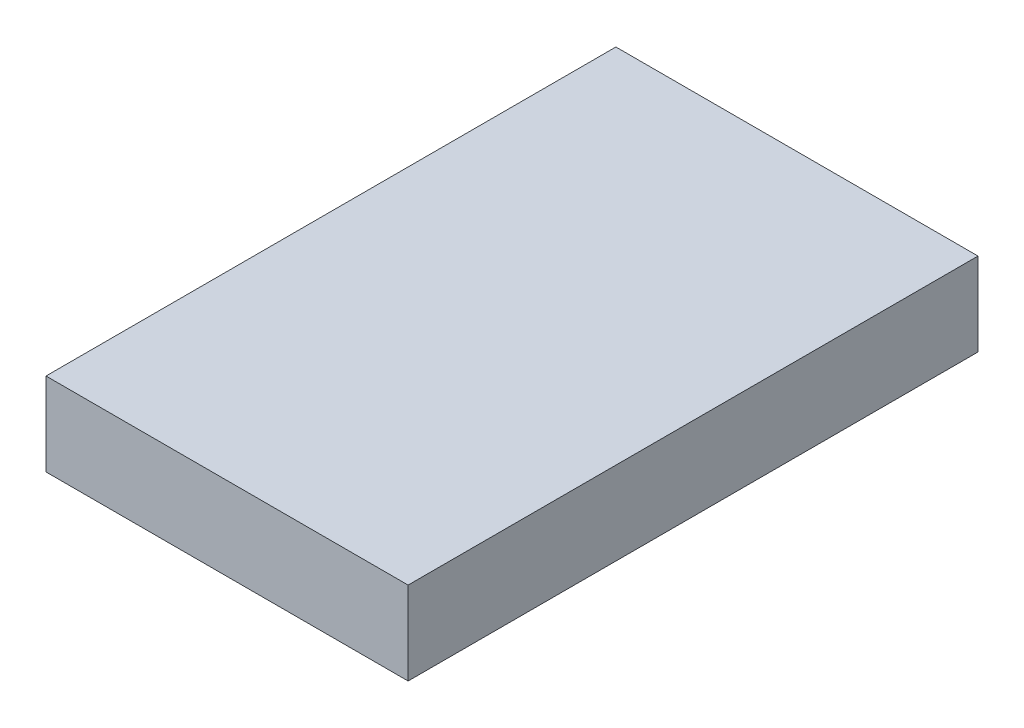
ISO-10303-21;
HEADER;
FILE_DESCRIPTION(('STEP AP214'),'2;1');
FILE_NAME('part.step','',(''),(''),'','','');
FILE_SCHEMA(('AUTOMOTIVE_DESIGN { 1 0 10303 214 1 1 1 1 }'));
ENDSEC;
DATA;
#1=APPLICATION_CONTEXT('core data for automotive mechanical design processes');
#2=APPLICATION_PROTOCOL_DEFINITION('international standard','automotive_design',2000,#1);
#3=PRODUCT_CONTEXT('',#1,'mechanical');
#4=PRODUCT('Part','Part','',(#3));
#5=PRODUCT_RELATED_PRODUCT_CATEGORY('part','',(#4));
#6=PRODUCT_DEFINITION_FORMATION('','',#4);
#7=PRODUCT_DEFINITION_CONTEXT('part definition',#1,'design');
#8=PRODUCT_DEFINITION('design','',#6,#7);
#9=PRODUCT_DEFINITION_SHAPE('','',#8);
#10=(LENGTH_UNIT() NAMED_UNIT(*) SI_UNIT(.MILLI.,.METRE.));
#11=(NAMED_UNIT(*) PLANE_ANGLE_UNIT() SI_UNIT($,.RADIAN.));
#12=(NAMED_UNIT(*) SI_UNIT($,.STERADIAN.) SOLID_ANGLE_UNIT());
#13=UNCERTAINTY_MEASURE_WITH_UNIT(LENGTH_MEASURE(1.E-05),#10,'distance_accuracy_value','');
#14=(GEOMETRIC_REPRESENTATION_CONTEXT(3) GLOBAL_UNCERTAINTY_ASSIGNED_CONTEXT((#13)) GLOBAL_UNIT_ASSIGNED_CONTEXT((#10,
#11,#12)) REPRESENTATION_CONTEXT('',''));
#15=CARTESIAN_POINT('',(0.,0.,0.));
#16=DIRECTION('',(0.,0.,1.));
#17=DIRECTION('',(1.,0.,0.));
#18=AXIS2_PLACEMENT_3D('',#15,#16,#17);
#19=CARTESIAN_POINT('',(193.675,88.9,-304.8));
#20=DIRECTION('',(-1.,0.,0.));
#21=DIRECTION('',(0.,0.,1.));
#22=AXIS2_PLACEMENT_3D('',#19,#20,#21);
#23=PLANE('',#22);
#24=DIRECTION('',(0.,0.,-1.));
#25=VECTOR('',#24,1.);
#26=CARTESIAN_POINT('',(193.675,0.,-304.8));
#27=LINE('',#26,#25);
#28=CARTESIAN_POINT('',(193.675,0.,304.8));
#29=VERTEX_POINT('',#28);
#30=CARTESIAN_POINT('',(193.675,0.,-304.8));
#31=VERTEX_POINT('',#30);
#32=EDGE_CURVE('E96',#29,#31,#27,.T.);
#33=ORIENTED_EDGE('',*,*,#32,.T.);
#34=DIRECTION('',(0.,-1.,0.));
#35=VECTOR('',#34,1.);
#36=CARTESIAN_POINT('',(193.675,88.9,-304.8));
#37=LINE('',#36,#35);
#38=CARTESIAN_POINT('',(193.675,88.9,-304.8));
#39=VERTEX_POINT('',#38);
#40=EDGE_CURVE('E11',#39,#31,#37,.T.);
#41=ORIENTED_EDGE('',*,*,#40,.F.);
#42=DIRECTION('',(0.,0.,-1.));
#43=VECTOR('',#42,1.);
#44=CARTESIAN_POINT('',(193.675,88.9,-304.8));
#45=LINE('',#44,#43);
#46=CARTESIAN_POINT('',(193.675,88.9,304.8));
#47=VERTEX_POINT('',#46);
#48=EDGE_CURVE('E84',#47,#39,#45,.T.);
#49=ORIENTED_EDGE('',*,*,#48,.F.);
#50=DIRECTION('',(0.,-1.,0.));
#51=VECTOR('',#50,1.);
#52=CARTESIAN_POINT('',(193.675,88.9,304.8));
#53=LINE('',#52,#51);
#54=EDGE_CURVE('E92',#47,#29,#53,.T.);
#55=ORIENTED_EDGE('',*,*,#54,.T.);
#56=EDGE_LOOP('',(#33,#41,#49,#55));
#57=FACE_BOUND('',#56,.T.);
#58=ADVANCED_FACE('F33',(#57),#23,.F.);
#59=CARTESIAN_POINT('',(-193.675,88.9,-304.8));
#60=DIRECTION('',(0.,0.,1.));
#61=DIRECTION('',(1.,0.,0.));
#62=AXIS2_PLACEMENT_3D('',#59,#60,#61);
#63=PLANE('',#62);
#64=DIRECTION('',(-1.,0.,0.));
#65=VECTOR('',#64,1.);
#66=CARTESIAN_POINT('',(-193.675,0.,-304.8));
#67=LINE('',#66,#65);
#68=CARTESIAN_POINT('',(-193.675,0.,-304.8));
#69=VERTEX_POINT('',#68);
#70=EDGE_CURVE('E88',#31,#69,#67,.T.);
#71=ORIENTED_EDGE('',*,*,#70,.T.);
#72=DIRECTION('',(0.,-1.,0.));
#73=VECTOR('',#72,1.);
#74=CARTESIAN_POINT('',(-193.675,88.9,-304.8));
#75=LINE('',#74,#73);
#76=CARTESIAN_POINT('',(-193.675,88.9,-304.8));
#77=VERTEX_POINT('',#76);
#78=EDGE_CURVE('E41',#77,#69,#75,.T.);
#79=ORIENTED_EDGE('',*,*,#78,.F.);
#80=DIRECTION('',(-1.,0.,0.));
#81=VECTOR('',#80,1.);
#82=CARTESIAN_POINT('',(-193.675,88.9,-304.8));
#83=LINE('',#82,#81);
#84=EDGE_CURVE('E79',#39,#77,#83,.T.);
#85=ORIENTED_EDGE('',*,*,#84,.F.);
#86=ORIENTED_EDGE('',*,*,#40,.T.);
#87=EDGE_LOOP('',(#71,#79,#85,#86));
#88=FACE_BOUND('',#87,.T.);
#89=ADVANCED_FACE('F87',(#88),#63,.F.);
#90=CARTESIAN_POINT('',(-193.675,88.9,-304.8));
#91=DIRECTION('',(1.,0.,0.));
#92=DIRECTION('',(0.,0.,-1.));
#93=AXIS2_PLACEMENT_3D('',#90,#91,#92);
#94=PLANE('',#93);
#95=DIRECTION('',(0.,0.,1.));
#96=VECTOR('',#95,1.);
#97=CARTESIAN_POINT('',(-193.675,0.,-304.8));
#98=LINE('',#97,#96);
#99=CARTESIAN_POINT('',(-193.675,0.,304.8));
#100=VERTEX_POINT('',#99);
#101=EDGE_CURVE('E66',#69,#100,#98,.T.);
#102=ORIENTED_EDGE('',*,*,#101,.T.);
#103=DIRECTION('',(0.,-1.,0.));
#104=VECTOR('',#103,1.);
#105=CARTESIAN_POINT('',(-193.675,88.9,304.8));
#106=LINE('',#105,#104);
#107=CARTESIAN_POINT('',(-193.675,88.9,304.8));
#108=VERTEX_POINT('',#107);
#109=EDGE_CURVE('E89',#108,#100,#106,.T.);
#110=ORIENTED_EDGE('',*,*,#109,.F.);
#111=DIRECTION('',(0.,0.,1.));
#112=VECTOR('',#111,1.);
#113=CARTESIAN_POINT('',(-193.675,88.9,-304.8));
#114=LINE('',#113,#112);
#115=EDGE_CURVE('E82',#77,#108,#114,.T.);
#116=ORIENTED_EDGE('',*,*,#115,.F.);
#117=ORIENTED_EDGE('',*,*,#78,.T.);
#118=EDGE_LOOP('',(#102,#110,#116,#117));
#119=FACE_BOUND('',#118,.T.);
#120=ADVANCED_FACE('F90',(#119),#94,.F.);
#121=CARTESIAN_POINT('',(-193.675,88.9,304.8));
#122=DIRECTION('',(0.,0.,-1.));
#123=DIRECTION('',(-1.,0.,0.));
#124=AXIS2_PLACEMENT_3D('',#121,#122,#123);
#125=PLANE('',#124);
#126=DIRECTION('',(1.,0.,0.));
#127=VECTOR('',#126,1.);
#128=CARTESIAN_POINT('',(-193.675,0.,304.8));
#129=LINE('',#128,#127);
#130=EDGE_CURVE('E72',#100,#29,#129,.T.);
#131=ORIENTED_EDGE('',*,*,#130,.T.);
#132=ORIENTED_EDGE('',*,*,#54,.F.);
#133=DIRECTION('',(1.,0.,0.));
#134=VECTOR('',#133,1.);
#135=CARTESIAN_POINT('',(-193.675,88.9,304.8));
#136=LINE('',#135,#134);
#137=EDGE_CURVE('E49',#108,#47,#136,.T.);
#138=ORIENTED_EDGE('',*,*,#137,.F.);
#139=ORIENTED_EDGE('',*,*,#109,.T.);
#140=EDGE_LOOP('',(#131,#132,#138,#139));
#141=FACE_BOUND('',#140,.T.);
#142=ADVANCED_FACE('F103',(#141),#125,.F.);
#143=CARTESIAN_POINT('',(0.,88.9,0.));
#144=DIRECTION('',(0.,1.,0.));
#145=DIRECTION('',(0.,0.,1.));
#146=AXIS2_PLACEMENT_3D('',#143,#144,#145);
#147=PLANE('',#146);
#148=ORIENTED_EDGE('',*,*,#48,.T.);
#149=ORIENTED_EDGE('',*,*,#84,.T.);
#150=ORIENTED_EDGE('',*,*,#115,.T.);
#151=ORIENTED_EDGE('',*,*,#137,.T.);
#152=EDGE_LOOP('',(#148,#149,#150,#151));
#153=FACE_BOUND('',#152,.T.);
#154=ADVANCED_FACE('F80',(#153),#147,.T.);
#155=CARTESIAN_POINT('',(0.,0.,0.));
#156=DIRECTION('',(0.,1.,0.));
#157=DIRECTION('',(0.,0.,1.));
#158=AXIS2_PLACEMENT_3D('',#155,#156,#157);
#159=PLANE('',#158);
#160=ORIENTED_EDGE('',*,*,#32,.F.);
#161=ORIENTED_EDGE('',*,*,#130,.F.);
#162=ORIENTED_EDGE('',*,*,#101,.F.);
#163=ORIENTED_EDGE('',*,*,#70,.F.);
#164=EDGE_LOOP('',(#160,#161,#162,#163));
#165=FACE_BOUND('',#164,.T.);
#166=ADVANCED_FACE('F106',(#165),#159,.F.);
#167=CLOSED_SHELL('',(#58,#89,#120,#142,#154,#166));
#168=MANIFOLD_SOLID_BREP('B2',#167);
#169=ADVANCED_BREP_SHAPE_REPRESENTATION('',(#18,#168),#14);
#170=SHAPE_DEFINITION_REPRESENTATION(#9,#169);
ENDSEC;
END-ISO-10303-21;
